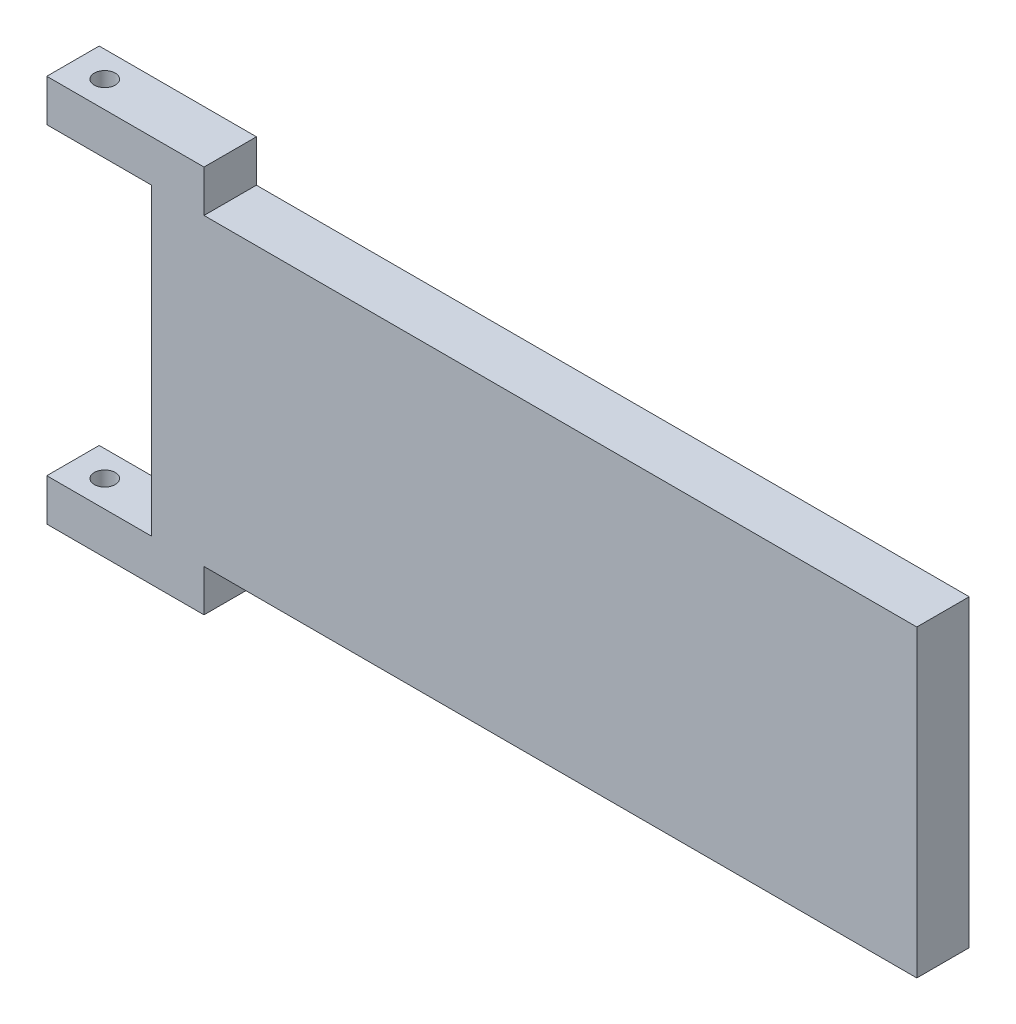
ISO-10303-21;
HEADER;
FILE_DESCRIPTION(('STEP AP214'),'2;1');
FILE_NAME('part.step','',(''),(''),'','','');
FILE_SCHEMA(('AUTOMOTIVE_DESIGN { 1 0 10303 214 1 1 1 1 }'));
ENDSEC;
DATA;
#1=APPLICATION_CONTEXT('core data for automotive mechanical design processes');
#2=APPLICATION_PROTOCOL_DEFINITION('international standard','automotive_design',2000,#1);
#3=PRODUCT_CONTEXT('',#1,'mechanical');
#4=PRODUCT('Part','Part','',(#3));
#5=PRODUCT_RELATED_PRODUCT_CATEGORY('part','',(#4));
#6=PRODUCT_DEFINITION_FORMATION('','',#4);
#7=PRODUCT_DEFINITION_CONTEXT('part definition',#1,'design');
#8=PRODUCT_DEFINITION('design','',#6,#7);
#9=PRODUCT_DEFINITION_SHAPE('','',#8);
#10=(LENGTH_UNIT() NAMED_UNIT(*) SI_UNIT(.MILLI.,.METRE.));
#11=(NAMED_UNIT(*) PLANE_ANGLE_UNIT() SI_UNIT($,.RADIAN.));
#12=(NAMED_UNIT(*) SI_UNIT($,.STERADIAN.) SOLID_ANGLE_UNIT());
#13=UNCERTAINTY_MEASURE_WITH_UNIT(LENGTH_MEASURE(1.E-05),#10,'distance_accuracy_value','');
#14=(GEOMETRIC_REPRESENTATION_CONTEXT(3) GLOBAL_UNCERTAINTY_ASSIGNED_CONTEXT((#13)) GLOBAL_UNIT_ASSIGNED_CONTEXT((#10,
#11,#12)) REPRESENTATION_CONTEXT('',''));
#15=CARTESIAN_POINT('',(0.,0.,0.));
#16=DIRECTION('',(0.,0.,1.));
#17=DIRECTION('',(1.,0.,0.));
#18=AXIS2_PLACEMENT_3D('',#15,#16,#17);
#19=CARTESIAN_POINT('',(0.,0.,5.));
#20=DIRECTION('',(0.,1.,0.));
#21=DIRECTION('',(0.,0.,1.));
#22=AXIS2_PLACEMENT_3D('',#19,#20,#21);
#23=PLANE('',#22);
#24=DIRECTION('',(1.,0.,0.));
#25=VECTOR('',#24,1.);
#26=CARTESIAN_POINT('',(0.,0.,0.));
#27=LINE('',#26,#25);
#28=CARTESIAN_POINT('',(5.,0.,0.));
#29=VERTEX_POINT('',#28);
#30=CARTESIAN_POINT('',(73.,0.,0.));
#31=VERTEX_POINT('',#30);
#32=EDGE_CURVE('E167',#29,#31,#27,.T.);
#33=ORIENTED_EDGE('',*,*,#32,.T.);
#34=DIRECTION('',(0.,0.,-1.));
#35=VECTOR('',#34,1.);
#36=CARTESIAN_POINT('',(73.,0.,5.));
#37=LINE('',#36,#35);
#38=CARTESIAN_POINT('',(73.,0.,5.));
#39=VERTEX_POINT('',#38);
#40=EDGE_CURVE('E11',#39,#31,#37,.T.);
#41=ORIENTED_EDGE('',*,*,#40,.F.);
#42=DIRECTION('',(1.,0.,0.));
#43=VECTOR('',#42,1.);
#44=CARTESIAN_POINT('',(0.,0.,5.));
#45=LINE('',#44,#43);
#46=CARTESIAN_POINT('',(5.,0.,5.));
#47=VERTEX_POINT('',#46);
#48=EDGE_CURVE('E210',#47,#39,#45,.T.);
#49=ORIENTED_EDGE('',*,*,#48,.F.);
#50=DIRECTION('',(0.,0.,-1.));
#51=VECTOR('',#50,1.);
#52=CARTESIAN_POINT('',(5.,0.,5.));
#53=LINE('',#52,#51);
#54=EDGE_CURVE('E57',#47,#29,#53,.T.);
#55=ORIENTED_EDGE('',*,*,#54,.T.);
#56=EDGE_LOOP('',(#33,#41,#49,#55));
#57=FACE_BOUND('',#56,.T.);
#58=ADVANCED_FACE('F39',(#57),#23,.F.);
#59=CARTESIAN_POINT('',(73.,0.,5.));
#60=DIRECTION('',(-1.,0.,0.));
#61=DIRECTION('',(0.,0.,1.));
#62=AXIS2_PLACEMENT_3D('',#59,#60,#61);
#63=PLANE('',#62);
#64=DIRECTION('',(0.,1.,0.));
#65=VECTOR('',#64,1.);
#66=CARTESIAN_POINT('',(73.,0.,0.));
#67=LINE('',#66,#65);
#68=CARTESIAN_POINT('',(73.,29.,0.));
#69=VERTEX_POINT('',#68);
#70=EDGE_CURVE('E170',#31,#69,#67,.T.);
#71=ORIENTED_EDGE('',*,*,#70,.T.);
#72=DIRECTION('',(0.,0.,-1.));
#73=VECTOR('',#72,1.);
#74=CARTESIAN_POINT('',(73.,29.,5.));
#75=LINE('',#74,#73);
#76=CARTESIAN_POINT('',(73.,29.,5.));
#77=VERTEX_POINT('',#76);
#78=EDGE_CURVE('E49',#77,#69,#75,.T.);
#79=ORIENTED_EDGE('',*,*,#78,.F.);
#80=DIRECTION('',(0.,1.,0.));
#81=VECTOR('',#80,1.);
#82=CARTESIAN_POINT('',(73.,0.,5.));
#83=LINE('',#82,#81);
#84=EDGE_CURVE('E107',#39,#77,#83,.T.);
#85=ORIENTED_EDGE('',*,*,#84,.F.);
#86=ORIENTED_EDGE('',*,*,#40,.T.);
#87=EDGE_LOOP('',(#71,#79,#85,#86));
#88=FACE_BOUND('',#87,.T.);
#89=ADVANCED_FACE('F243',(#88),#63,.F.);
#90=CARTESIAN_POINT('',(0.,29.,5.));
#91=DIRECTION('',(0.,1.,0.));
#92=DIRECTION('',(0.,0.,1.));
#93=AXIS2_PLACEMENT_3D('',#90,#91,#92);
#94=PLANE('',#93);
#95=DIRECTION('',(1.,0.,0.));
#96=VECTOR('',#95,1.);
#97=CARTESIAN_POINT('',(0.,29.,0.));
#98=LINE('',#97,#96);
#99=CARTESIAN_POINT('',(5.,29.,0.));
#100=VERTEX_POINT('',#99);
#101=EDGE_CURVE('E175',#100,#69,#98,.T.);
#102=ORIENTED_EDGE('',*,*,#101,.F.);
#103=DIRECTION('',(0.,0.,-1.));
#104=VECTOR('',#103,1.);
#105=CARTESIAN_POINT('',(5.,29.,5.));
#106=LINE('',#105,#104);
#107=CARTESIAN_POINT('',(5.,29.,5.));
#108=VERTEX_POINT('',#107);
#109=EDGE_CURVE('E233',#108,#100,#106,.T.);
#110=ORIENTED_EDGE('',*,*,#109,.F.);
#111=DIRECTION('',(1.,0.,0.));
#112=VECTOR('',#111,1.);
#113=CARTESIAN_POINT('',(0.,29.,5.));
#114=LINE('',#113,#112);
#115=EDGE_CURVE('E242',#108,#77,#114,.T.);
#116=ORIENTED_EDGE('',*,*,#115,.T.);
#117=ORIENTED_EDGE('',*,*,#78,.T.);
#118=EDGE_LOOP('',(#102,#110,#116,#117));
#119=FACE_BOUND('',#118,.T.);
#120=ADVANCED_FACE('F240',(#119),#94,.T.);
#121=CARTESIAN_POINT('',(5.,0.,5.));
#122=DIRECTION('',(-1.,0.,0.));
#123=DIRECTION('',(0.,0.,1.));
#124=AXIS2_PLACEMENT_3D('',#121,#122,#123);
#125=PLANE('',#124);
#126=DIRECTION('',(0.,1.,0.));
#127=VECTOR('',#126,1.);
#128=CARTESIAN_POINT('',(5.,0.,0.));
#129=LINE('',#128,#127);
#130=CARTESIAN_POINT('',(5.,33.,0.));
#131=VERTEX_POINT('',#130);
#132=EDGE_CURVE('E179',#100,#131,#129,.T.);
#133=ORIENTED_EDGE('',*,*,#132,.T.);
#134=DIRECTION('',(0.,0.,-1.));
#135=VECTOR('',#134,1.);
#136=CARTESIAN_POINT('',(5.,33.,5.));
#137=LINE('',#136,#135);
#138=CARTESIAN_POINT('',(5.,33.,5.));
#139=VERTEX_POINT('',#138);
#140=EDGE_CURVE('E229',#139,#131,#137,.T.);
#141=ORIENTED_EDGE('',*,*,#140,.F.);
#142=DIRECTION('',(0.,1.,0.));
#143=VECTOR('',#142,1.);
#144=CARTESIAN_POINT('',(5.,0.,5.));
#145=LINE('',#144,#143);
#146=EDGE_CURVE('E262',#108,#139,#145,.T.);
#147=ORIENTED_EDGE('',*,*,#146,.F.);
#148=ORIENTED_EDGE('',*,*,#109,.T.);
#149=EDGE_LOOP('',(#133,#141,#147,#148));
#150=FACE_BOUND('',#149,.T.);
#151=ADVANCED_FACE('F251',(#150),#125,.F.);
#152=CARTESIAN_POINT('',(0.,33.,5.));
#153=DIRECTION('',(0.,-1.,0.));
#154=DIRECTION('',(0.,0.,-1.));
#155=AXIS2_PLACEMENT_3D('',#152,#153,#154);
#156=PLANE('',#155);
#157=CARTESIAN_POINT('',(-7.,33.,2.46940407953389));
#158=DIRECTION('',(0.,1.,0.));
#159=DIRECTION('',(0.,0.,1.));
#160=AXIS2_PLACEMENT_3D('',#157,#158,#159);
#161=CIRCLE('',#160,1.);
#162=CARTESIAN_POINT('',(-7.,33.,3.46940407953389));
#163=VERTEX_POINT('',#162);
#164=EDGE_CURVE('E331',#163,#163,#161,.T.);
#165=ORIENTED_EDGE('',*,*,#164,.F.);
#166=EDGE_LOOP('',(#165));
#167=FACE_BOUND('',#166,.T.);
#168=DIRECTION('',(-1.,0.,0.));
#169=VECTOR('',#168,1.);
#170=CARTESIAN_POINT('',(0.,33.,0.));
#171=LINE('',#170,#169);
#172=CARTESIAN_POINT('',(-10.,33.,0.));
#173=VERTEX_POINT('',#172);
#174=EDGE_CURVE('E182',#131,#173,#171,.T.);
#175=ORIENTED_EDGE('',*,*,#174,.T.);
#176=DIRECTION('',(0.,0.,-1.));
#177=VECTOR('',#176,1.);
#178=CARTESIAN_POINT('',(-10.,33.,5.));
#179=LINE('',#178,#177);
#180=CARTESIAN_POINT('',(-10.,33.,5.));
#181=VERTEX_POINT('',#180);
#182=EDGE_CURVE('E226',#181,#173,#179,.T.);
#183=ORIENTED_EDGE('',*,*,#182,.F.);
#184=DIRECTION('',(-1.,0.,0.));
#185=VECTOR('',#184,1.);
#186=CARTESIAN_POINT('',(0.,33.,5.));
#187=LINE('',#186,#185);
#188=EDGE_CURVE('E257',#139,#181,#187,.T.);
#189=ORIENTED_EDGE('',*,*,#188,.F.);
#190=ORIENTED_EDGE('',*,*,#140,.T.);
#191=EDGE_LOOP('',(#175,#183,#189,#190));
#192=FACE_BOUND('',#191,.T.);
#193=ADVANCED_FACE('F255',(#167,#192),#156,.F.);
#194=CARTESIAN_POINT('',(-10.,0.,5.));
#195=DIRECTION('',(-1.,0.,0.));
#196=DIRECTION('',(0.,0.,1.));
#197=AXIS2_PLACEMENT_3D('',#194,#195,#196);
#198=PLANE('',#197);
#199=DIRECTION('',(0.,1.,0.));
#200=VECTOR('',#199,1.);
#201=CARTESIAN_POINT('',(-10.,0.,0.));
#202=LINE('',#201,#200);
#203=CARTESIAN_POINT('',(-10.,29.,0.));
#204=VERTEX_POINT('',#203);
#205=EDGE_CURVE('E186',#204,#173,#202,.T.);
#206=ORIENTED_EDGE('',*,*,#205,.F.);
#207=DIRECTION('',(0.,0.,-1.));
#208=VECTOR('',#207,1.);
#209=CARTESIAN_POINT('',(-10.,29.,5.));
#210=LINE('',#209,#208);
#211=CARTESIAN_POINT('',(-10.,29.,5.));
#212=VERTEX_POINT('',#211);
#213=EDGE_CURVE('E223',#212,#204,#210,.T.);
#214=ORIENTED_EDGE('',*,*,#213,.F.);
#215=DIRECTION('',(0.,1.,0.));
#216=VECTOR('',#215,1.);
#217=CARTESIAN_POINT('',(-10.,0.,5.));
#218=LINE('',#217,#216);
#219=EDGE_CURVE('E261',#212,#181,#218,.T.);
#220=ORIENTED_EDGE('',*,*,#219,.T.);
#221=ORIENTED_EDGE('',*,*,#182,.T.);
#222=EDGE_LOOP('',(#206,#214,#220,#221));
#223=FACE_BOUND('',#222,.T.);
#224=ADVANCED_FACE('F349',(#223),#198,.T.);
#225=CARTESIAN_POINT('',(0.,29.,5.));
#226=DIRECTION('',(0.,-1.,0.));
#227=DIRECTION('',(1.,0.,0.));
#228=AXIS2_PLACEMENT_3D('',#225,#226,#227);
#229=PLANE('',#228);
#230=CARTESIAN_POINT('',(-7.,29.,2.46940407953389));
#231=DIRECTION('',(0.,-1.,0.));
#232=DIRECTION('',(1.,0.,0.));
#233=AXIS2_PLACEMENT_3D('',#230,#231,#232);
#234=CIRCLE('',#233,1.);
#235=CARTESIAN_POINT('',(-6.,29.,2.46940407953389));
#236=VERTEX_POINT('',#235);
#237=EDGE_CURVE('E171',#236,#236,#234,.T.);
#238=ORIENTED_EDGE('',*,*,#237,.F.);
#239=EDGE_LOOP('',(#238));
#240=FACE_BOUND('',#239,.T.);
#241=DIRECTION('',(-1.,0.,0.));
#242=VECTOR('',#241,1.);
#243=CARTESIAN_POINT('',(0.,29.,0.));
#244=LINE('',#243,#242);
#245=CARTESIAN_POINT('',(0.,29.,0.));
#246=VERTEX_POINT('',#245);
#247=EDGE_CURVE('E190',#246,#204,#244,.T.);
#248=ORIENTED_EDGE('',*,*,#247,.F.);
#249=DIRECTION('',(0.,0.,-1.));
#250=VECTOR('',#249,1.);
#251=CARTESIAN_POINT('',(0.,29.,5.));
#252=LINE('',#251,#250);
#253=CARTESIAN_POINT('',(0.,29.,5.));
#254=VERTEX_POINT('',#253);
#255=EDGE_CURVE('E220',#254,#246,#252,.T.);
#256=ORIENTED_EDGE('',*,*,#255,.F.);
#257=DIRECTION('',(-1.,0.,0.));
#258=VECTOR('',#257,1.);
#259=CARTESIAN_POINT('',(0.,29.,5.));
#260=LINE('',#259,#258);
#261=EDGE_CURVE('E266',#254,#212,#260,.T.);
#262=ORIENTED_EDGE('',*,*,#261,.T.);
#263=ORIENTED_EDGE('',*,*,#213,.T.);
#264=EDGE_LOOP('',(#248,#256,#262,#263));
#265=FACE_BOUND('',#264,.T.);
#266=ADVANCED_FACE('F284',(#240,#265),#229,.T.);
#267=CARTESIAN_POINT('',(0.,0.,5.));
#268=DIRECTION('',(-1.,0.,0.));
#269=DIRECTION('',(0.,0.,1.));
#270=AXIS2_PLACEMENT_3D('',#267,#268,#269);
#271=PLANE('',#270);
#272=DIRECTION('',(0.,1.,0.));
#273=VECTOR('',#272,1.);
#274=CARTESIAN_POINT('',(0.,0.,0.));
#275=LINE('',#274,#273);
#276=CARTESIAN_POINT('',(0.,0.,0.));
#277=VERTEX_POINT('',#276);
#278=EDGE_CURVE('E194',#277,#246,#275,.T.);
#279=ORIENTED_EDGE('',*,*,#278,.F.);
#280=DIRECTION('',(0.,0.,-1.));
#281=VECTOR('',#280,1.);
#282=CARTESIAN_POINT('',(0.,0.,5.));
#283=LINE('',#282,#281);
#284=CARTESIAN_POINT('',(0.,0.,5.));
#285=VERTEX_POINT('',#284);
#286=EDGE_CURVE('E217',#285,#277,#283,.T.);
#287=ORIENTED_EDGE('',*,*,#286,.F.);
#288=DIRECTION('',(0.,1.,0.));
#289=VECTOR('',#288,1.);
#290=CARTESIAN_POINT('',(0.,0.,5.));
#291=LINE('',#290,#289);
#292=EDGE_CURVE('E274',#285,#254,#291,.T.);
#293=ORIENTED_EDGE('',*,*,#292,.T.);
#294=ORIENTED_EDGE('',*,*,#255,.T.);
#295=EDGE_LOOP('',(#279,#287,#293,#294));
#296=FACE_BOUND('',#295,.T.);
#297=ADVANCED_FACE('F280',(#296),#271,.T.);
#298=CARTESIAN_POINT('',(0.,0.,5.));
#299=DIRECTION('',(0.,-1.,0.));
#300=DIRECTION('',(1.,0.,0.));
#301=AXIS2_PLACEMENT_3D('',#298,#299,#300);
#302=PLANE('',#301);
#303=CARTESIAN_POINT('',(-7.,0.,2.46940407953389));
#304=DIRECTION('',(0.,-1.,0.));
#305=DIRECTION('',(1.,0.,0.));
#306=AXIS2_PLACEMENT_3D('',#303,#304,#305);
#307=CIRCLE('',#306,1.);
#308=CARTESIAN_POINT('',(-6.,0.,2.46940407953389));
#309=VERTEX_POINT('',#308);
#310=EDGE_CURVE('E42',#309,#309,#307,.T.);
#311=ORIENTED_EDGE('',*,*,#310,.T.);
#312=EDGE_LOOP('',(#311));
#313=FACE_BOUND('',#312,.T.);
#314=DIRECTION('',(-1.,0.,0.));
#315=VECTOR('',#314,1.);
#316=CARTESIAN_POINT('',(0.,0.,0.));
#317=LINE('',#316,#315);
#318=CARTESIAN_POINT('',(-10.,0.,0.));
#319=VERTEX_POINT('',#318);
#320=EDGE_CURVE('E198',#277,#319,#317,.T.);
#321=ORIENTED_EDGE('',*,*,#320,.T.);
#322=DIRECTION('',(0.,0.,-1.));
#323=VECTOR('',#322,1.);
#324=CARTESIAN_POINT('',(-10.,0.,5.));
#325=LINE('',#324,#323);
#326=CARTESIAN_POINT('',(-10.,0.,5.));
#327=VERTEX_POINT('',#326);
#328=EDGE_CURVE('E157',#327,#319,#325,.T.);
#329=ORIENTED_EDGE('',*,*,#328,.F.);
#330=DIRECTION('',(-1.,0.,0.));
#331=VECTOR('',#330,1.);
#332=CARTESIAN_POINT('',(0.,0.,5.));
#333=LINE('',#332,#331);
#334=EDGE_CURVE('E143',#285,#327,#333,.T.);
#335=ORIENTED_EDGE('',*,*,#334,.F.);
#336=ORIENTED_EDGE('',*,*,#286,.T.);
#337=EDGE_LOOP('',(#321,#329,#335,#336));
#338=FACE_BOUND('',#337,.T.);
#339=ADVANCED_FACE('F288',(#313,#338),#302,.F.);
#340=CARTESIAN_POINT('',(-10.,0.,5.));
#341=DIRECTION('',(1.,0.,0.));
#342=DIRECTION('',(0.,0.,-1.));
#343=AXIS2_PLACEMENT_3D('',#340,#341,#342);
#344=PLANE('',#343);
#345=DIRECTION('',(0.,-1.,0.));
#346=VECTOR('',#345,1.);
#347=CARTESIAN_POINT('',(-10.,0.,0.));
#348=LINE('',#347,#346);
#349=CARTESIAN_POINT('',(-10.,-4.,0.));
#350=VERTEX_POINT('',#349);
#351=EDGE_CURVE('E153',#319,#350,#348,.T.);
#352=ORIENTED_EDGE('',*,*,#351,.T.);
#353=DIRECTION('',(0.,0.,-1.));
#354=VECTOR('',#353,1.);
#355=CARTESIAN_POINT('',(-10.,-4.,5.));
#356=LINE('',#355,#354);
#357=CARTESIAN_POINT('',(-10.,-4.,5.));
#358=VERTEX_POINT('',#357);
#359=EDGE_CURVE('E150',#358,#350,#356,.T.);
#360=ORIENTED_EDGE('',*,*,#359,.F.);
#361=DIRECTION('',(0.,-1.,0.));
#362=VECTOR('',#361,1.);
#363=CARTESIAN_POINT('',(-10.,0.,5.));
#364=LINE('',#363,#362);
#365=EDGE_CURVE('E135',#327,#358,#364,.T.);
#366=ORIENTED_EDGE('',*,*,#365,.F.);
#367=ORIENTED_EDGE('',*,*,#328,.T.);
#368=EDGE_LOOP('',(#352,#360,#366,#367));
#369=FACE_BOUND('',#368,.T.);
#370=ADVANCED_FACE('F151',(#369),#344,.F.);
#371=CARTESIAN_POINT('',(0.,-4.,5.));
#372=DIRECTION('',(0.,-1.,0.));
#373=DIRECTION('',(1.,0.,0.));
#374=AXIS2_PLACEMENT_3D('',#371,#372,#373);
#375=PLANE('',#374);
#376=DIRECTION('',(-1.,0.,0.));
#377=VECTOR('',#376,1.);
#378=CARTESIAN_POINT('',(0.,-4.,0.));
#379=LINE('',#378,#377);
#380=CARTESIAN_POINT('',(5.,-4.,0.));
#381=VERTEX_POINT('',#380);
#382=EDGE_CURVE('E203',#381,#350,#379,.T.);
#383=ORIENTED_EDGE('',*,*,#382,.F.);
#384=DIRECTION('',(0.,0.,-1.));
#385=VECTOR('',#384,1.);
#386=CARTESIAN_POINT('',(5.,-4.,5.));
#387=LINE('',#386,#385);
#388=CARTESIAN_POINT('',(5.,-4.,5.));
#389=VERTEX_POINT('',#388);
#390=EDGE_CURVE('E95',#389,#381,#387,.T.);
#391=ORIENTED_EDGE('',*,*,#390,.F.);
#392=DIRECTION('',(-1.,0.,0.));
#393=VECTOR('',#392,1.);
#394=CARTESIAN_POINT('',(0.,-4.,5.));
#395=LINE('',#394,#393);
#396=EDGE_CURVE('E140',#389,#358,#395,.T.);
#397=ORIENTED_EDGE('',*,*,#396,.T.);
#398=ORIENTED_EDGE('',*,*,#359,.T.);
#399=EDGE_LOOP('',(#383,#391,#397,#398));
#400=FACE_BOUND('',#399,.T.);
#401=ADVANCED_FACE('F159',(#400),#375,.T.);
#402=CARTESIAN_POINT('',(5.,0.,5.));
#403=DIRECTION('',(1.,0.,0.));
#404=DIRECTION('',(0.,1.,0.));
#405=AXIS2_PLACEMENT_3D('',#402,#403,#404);
#406=PLANE('',#405);
#407=DIRECTION('',(0.,-1.,0.));
#408=VECTOR('',#407,1.);
#409=CARTESIAN_POINT('',(5.,0.,0.));
#410=LINE('',#409,#408);
#411=EDGE_CURVE('E206',#29,#381,#410,.T.);
#412=ORIENTED_EDGE('',*,*,#411,.F.);
#413=ORIENTED_EDGE('',*,*,#54,.F.);
#414=DIRECTION('',(0.,-1.,0.));
#415=VECTOR('',#414,1.);
#416=CARTESIAN_POINT('',(5.,0.,5.));
#417=LINE('',#416,#415);
#418=EDGE_CURVE('E161',#47,#389,#417,.T.);
#419=ORIENTED_EDGE('',*,*,#418,.T.);
#420=ORIENTED_EDGE('',*,*,#390,.T.);
#421=EDGE_LOOP('',(#412,#413,#419,#420));
#422=FACE_BOUND('',#421,.T.);
#423=ADVANCED_FACE('F303',(#422),#406,.T.);
#424=CARTESIAN_POINT('',(0.,0.,5.));
#425=DIRECTION('',(0.,0.,1.));
#426=DIRECTION('',(1.,0.,0.));
#427=AXIS2_PLACEMENT_3D('',#424,#425,#426);
#428=PLANE('',#427);
#429=ORIENTED_EDGE('',*,*,#48,.T.);
#430=ORIENTED_EDGE('',*,*,#84,.T.);
#431=ORIENTED_EDGE('',*,*,#115,.F.);
#432=ORIENTED_EDGE('',*,*,#146,.T.);
#433=ORIENTED_EDGE('',*,*,#188,.T.);
#434=ORIENTED_EDGE('',*,*,#219,.F.);
#435=ORIENTED_EDGE('',*,*,#261,.F.);
#436=ORIENTED_EDGE('',*,*,#292,.F.);
#437=ORIENTED_EDGE('',*,*,#334,.T.);
#438=ORIENTED_EDGE('',*,*,#365,.T.);
#439=ORIENTED_EDGE('',*,*,#396,.F.);
#440=ORIENTED_EDGE('',*,*,#418,.F.);
#441=EDGE_LOOP('',(#429,#430,#431,#432,#433,#434,#435,#436,#437,#438,#439,#440));
#442=FACE_BOUND('',#441,.T.);
#443=ADVANCED_FACE('F137',(#442),#428,.T.);
#444=CARTESIAN_POINT('',(0.,0.,0.));
#445=DIRECTION('',(0.,0.,1.));
#446=DIRECTION('',(1.,0.,0.));
#447=AXIS2_PLACEMENT_3D('',#444,#445,#446);
#448=PLANE('',#447);
#449=ORIENTED_EDGE('',*,*,#32,.F.);
#450=ORIENTED_EDGE('',*,*,#411,.T.);
#451=ORIENTED_EDGE('',*,*,#382,.T.);
#452=ORIENTED_EDGE('',*,*,#351,.F.);
#453=ORIENTED_EDGE('',*,*,#320,.F.);
#454=ORIENTED_EDGE('',*,*,#278,.T.);
#455=ORIENTED_EDGE('',*,*,#247,.T.);
#456=ORIENTED_EDGE('',*,*,#205,.T.);
#457=ORIENTED_EDGE('',*,*,#174,.F.);
#458=ORIENTED_EDGE('',*,*,#132,.F.);
#459=ORIENTED_EDGE('',*,*,#101,.T.);
#460=ORIENTED_EDGE('',*,*,#70,.F.);
#461=EDGE_LOOP('',(#449,#450,#451,#452,#453,#454,#455,#456,#457,#458,#459,#460));
#462=FACE_BOUND('',#461,.T.);
#463=ADVANCED_FACE('F247',(#462),#448,.F.);
#464=CARTESIAN_POINT('',(-7.,-2.,2.46940407953389));
#465=DIRECTION('',(0.,1.,0.));
#466=DIRECTION('',(0.,0.,1.));
#467=AXIS2_PLACEMENT_3D('',#464,#465,#466);
#468=PLANE('',#467);
#469=CARTESIAN_POINT('',(-7.,-2.,2.46940407953389));
#470=DIRECTION('',(0.,1.,0.));
#471=DIRECTION('',(0.,0.,1.));
#472=AXIS2_PLACEMENT_3D('',#469,#470,#471);
#473=CIRCLE('',#472,1.);
#474=CARTESIAN_POINT('',(-7.,-2.,3.46940407953389));
#475=VERTEX_POINT('',#474);
#476=EDGE_CURVE('E329',#475,#475,#473,.T.);
#477=ORIENTED_EDGE('',*,*,#476,.T.);
#478=EDGE_LOOP('',(#477));
#479=FACE_BOUND('',#478,.T.);
#480=ADVANCED_FACE('F314',(#479),#468,.T.);
#481=CARTESIAN_POINT('',(-7.,-2.,2.46940407953389));
#482=DIRECTION('',(0.,1.,0.));
#483=DIRECTION('',(0.,0.,1.));
#484=AXIS2_PLACEMENT_3D('',#481,#482,#483);
#485=CYLINDRICAL_SURFACE('',#484,1.);
#486=ORIENTED_EDGE('',*,*,#476,.F.);
#487=EDGE_LOOP('',(#486));
#488=FACE_BOUND('',#487,.T.);
#489=ORIENTED_EDGE('',*,*,#310,.F.);
#490=EDGE_LOOP('',(#489));
#491=FACE_BOUND('',#490,.T.);
#492=ADVANCED_FACE('F319',(#488,#491),#485,.F.);
#493=ORIENTED_EDGE('',*,*,#237,.T.);
#494=EDGE_LOOP('',(#493));
#495=FACE_BOUND('',#494,.T.);
#496=ORIENTED_EDGE('',*,*,#164,.T.);
#497=EDGE_LOOP('',(#496));
#498=FACE_BOUND('',#497,.T.);
#499=ADVANCED_FACE('F316',(#495,#498),#485,.F.);
#500=CLOSED_SHELL('',(#58,#89,#120,#151,#193,#224,#266,#297,#339,#370,#401,#423,#443,#463,#480,
#492,#499));
#501=MANIFOLD_SOLID_BREP('B2',#500);
#502=ADVANCED_BREP_SHAPE_REPRESENTATION('',(#18,#501),#14);
#503=SHAPE_DEFINITION_REPRESENTATION(#9,#502);
ENDSEC;
END-ISO-10303-21;
